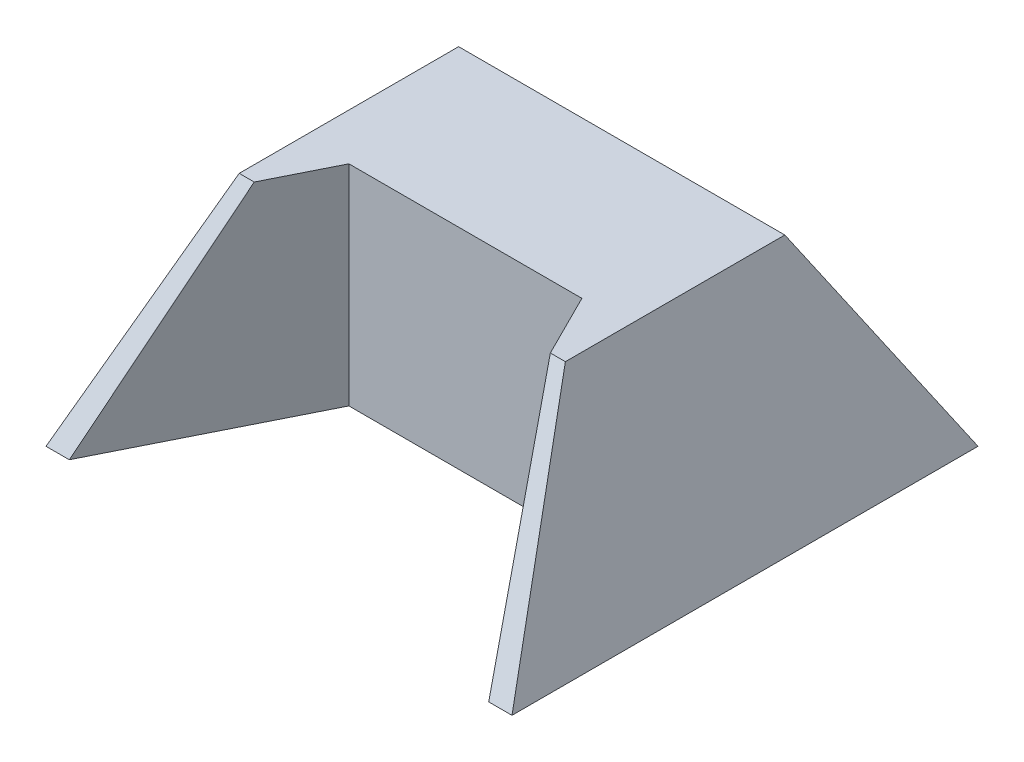
ISO-10303-21;
HEADER;
FILE_DESCRIPTION(('STEP AP214'),'2;1');
FILE_NAME('part.step','',(''),(''),'','','');
FILE_SCHEMA(('AUTOMOTIVE_DESIGN { 1 0 10303 214 1 1 1 1 }'));
ENDSEC;
DATA;
#1=APPLICATION_CONTEXT('core data for automotive mechanical design processes');
#2=APPLICATION_PROTOCOL_DEFINITION('international standard','automotive_design',2000,#1);
#3=PRODUCT_CONTEXT('',#1,'mechanical');
#4=PRODUCT('Part','Part','',(#3));
#5=PRODUCT_RELATED_PRODUCT_CATEGORY('part','',(#4));
#6=PRODUCT_DEFINITION_FORMATION('','',#4);
#7=PRODUCT_DEFINITION_CONTEXT('part definition',#1,'design');
#8=PRODUCT_DEFINITION('design','',#6,#7);
#9=PRODUCT_DEFINITION_SHAPE('','',#8);
#10=(LENGTH_UNIT() NAMED_UNIT(*) SI_UNIT(.MILLI.,.METRE.));
#11=(NAMED_UNIT(*) PLANE_ANGLE_UNIT() SI_UNIT($,.RADIAN.));
#12=(NAMED_UNIT(*) SI_UNIT($,.STERADIAN.) SOLID_ANGLE_UNIT());
#13=UNCERTAINTY_MEASURE_WITH_UNIT(LENGTH_MEASURE(1.E-05),#10,'distance_accuracy_value','');
#14=(GEOMETRIC_REPRESENTATION_CONTEXT(3) GLOBAL_UNCERTAINTY_ASSIGNED_CONTEXT((#13)) GLOBAL_UNIT_ASSIGNED_CONTEXT((#10,
#11,#12)) REPRESENTATION_CONTEXT('',''));
#15=CARTESIAN_POINT('',(0.,0.,0.));
#16=DIRECTION('',(0.,0.,1.));
#17=DIRECTION('',(1.,0.,0.));
#18=AXIS2_PLACEMENT_3D('',#15,#16,#17);
#19=CARTESIAN_POINT('',(100.,0.,0.));
#20=DIRECTION('',(0.,-0.50680946650861,-0.862058098191333));
#21=DIRECTION('',(0.,0.862058098191333,-0.50680946650861));
#22=AXIS2_PLACEMENT_3D('',#19,#20,#21);
#23=PLANE('',#22);
#24=DIRECTION('',(1.,0.,0.));
#25=VECTOR('',#24,1.);
#26=CARTESIAN_POINT('',(0.,0.,0.));
#27=LINE('',#26,#25);
#28=CARTESIAN_POINT('',(0.,0.,0.));
#29=VERTEX_POINT('',#28);
#30=CARTESIAN_POINT('',(5.,0.,0.));
#31=VERTEX_POINT('',#30);
#32=EDGE_CURVE('E152',#29,#31,#27,.T.);
#33=ORIENTED_EDGE('',*,*,#32,.T.);
#34=DIRECTION('',(0.245640655200604,0.83564546463383,-0.491281310401208));
#35=VECTOR('',#34,1.);
#36=CARTESIAN_POINT('',(10.7322364913013,19.5005074475664,-11.4644729826026));
#37=LINE('',#36,#35);
#38=CARTESIAN_POINT('',(18.2278938280014,45.,-26.4557876560027));
#39=VERTEX_POINT('',#38);
#40=EDGE_CURVE('E11',#31,#39,#37,.T.);
#41=ORIENTED_EDGE('',*,*,#40,.T.);
#42=DIRECTION('',(-1.,0.,0.));
#43=VECTOR('',#42,1.);
#44=CARTESIAN_POINT('',(100.,45.,-26.4557876560027));
#45=LINE('',#44,#43);
#46=CARTESIAN_POINT('',(15.,45.,-26.4557876560027));
#47=VERTEX_POINT('',#46);
#48=EDGE_CURVE('E124',#39,#47,#45,.T.);
#49=ORIENTED_EDGE('',*,*,#48,.T.);
#50=DIRECTION('',(-0.276176659095958,-0.828529977287874,0.487098069905794));
#51=VECTOR('',#50,1.);
#52=CARTESIAN_POINT('',(24.8935438142779,74.6806314428337,-43.9052206103958));
#53=LINE('',#52,#51);
#54=EDGE_CURVE('E138',#47,#29,#53,.T.);
#55=ORIENTED_EDGE('',*,*,#54,.T.);
#56=EDGE_LOOP('',(#33,#41,#49,#55));
#57=FACE_BOUND('',#56,.T.);
#58=ADVANCED_FACE('F37',(#57),#23,.F.);
#59=CARTESIAN_POINT('',(15.,45.,-100.));
#60=DIRECTION('',(-0.948683298050514,0.316227766016838,0.));
#61=DIRECTION('',(-0.316227766016838,-0.948683298050514,0.));
#62=AXIS2_PLACEMENT_3D('',#59,#60,#61);
#63=PLANE('',#62);
#64=ORIENTED_EDGE('',*,*,#54,.F.);
#65=DIRECTION('',(0.,0.,1.));
#66=VECTOR('',#65,1.);
#67=CARTESIAN_POINT('',(15.,45.,-100.));
#68=LINE('',#67,#66);
#69=CARTESIAN_POINT('',(15.,45.,-73.5442123439973));
#70=VERTEX_POINT('',#69);
#71=EDGE_CURVE('E155',#70,#47,#68,.T.);
#72=ORIENTED_EDGE('',*,*,#71,.F.);
#73=DIRECTION('',(-0.276176659095958,-0.828529977287874,-0.487098069905794));
#74=VECTOR('',#73,1.);
#75=CARTESIAN_POINT('',(11.4410320544107,34.3230961632322,-79.8212323601993));
#76=LINE('',#75,#74);
#77=CARTESIAN_POINT('',(0.,0.,-100.));
#78=VERTEX_POINT('',#77);
#79=EDGE_CURVE('E144',#70,#78,#76,.T.);
#80=ORIENTED_EDGE('',*,*,#79,.T.);
#81=DIRECTION('',(0.,0.,1.));
#82=VECTOR('',#81,1.);
#83=CARTESIAN_POINT('',(0.,0.,-100.));
#84=LINE('',#83,#82);
#85=EDGE_CURVE('E151',#78,#29,#84,.T.);
#86=ORIENTED_EDGE('',*,*,#85,.T.);
#87=EDGE_LOOP('',(#64,#72,#80,#86));
#88=FACE_BOUND('',#87,.T.);
#89=ADVANCED_FACE('F39',(#88),#63,.T.);
#90=CARTESIAN_POINT('',(85.,45.,-100.));
#91=DIRECTION('',(0.,1.,0.));
#92=DIRECTION('',(-1.,0.,0.));
#93=AXIS2_PLACEMENT_3D('',#90,#91,#92);
#94=PLANE('',#93);
#95=DIRECTION('',(0.447213595499958,0.,-0.894427190999916));
#96=VECTOR('',#95,1.);
#97=CARTESIAN_POINT('',(25.,45.,-40.));
#98=LINE('',#97,#96);
#99=CARTESIAN_POINT('',(25.,45.,-40.));
#100=VERTEX_POINT('',#99);
#101=EDGE_CURVE('E105',#39,#100,#98,.T.);
#102=ORIENTED_EDGE('',*,*,#101,.T.);
#103=DIRECTION('',(1.,0.,0.));
#104=VECTOR('',#103,1.);
#105=CARTESIAN_POINT('',(75.,45.,-40.));
#106=LINE('',#105,#104);
#107=CARTESIAN_POINT('',(75.,45.,-40.));
#108=VERTEX_POINT('',#107);
#109=EDGE_CURVE('E115',#100,#108,#106,.T.);
#110=ORIENTED_EDGE('',*,*,#109,.T.);
#111=DIRECTION('',(0.447213595499958,0.,0.894427190999916));
#112=VECTOR('',#111,1.);
#113=CARTESIAN_POINT('',(95.,45.,0.));
#114=LINE('',#113,#112);
#115=CARTESIAN_POINT('',(81.7721061719986,45.,-26.4557876560027));
#116=VERTEX_POINT('',#115);
#117=EDGE_CURVE('E112',#108,#116,#114,.T.);
#118=ORIENTED_EDGE('',*,*,#117,.T.);
#119=CARTESIAN_POINT('',(85.,45.,-26.4557876560027));
#120=VERTEX_POINT('',#119);
#121=EDGE_CURVE('E133',#120,#116,#45,.T.);
#122=ORIENTED_EDGE('',*,*,#121,.F.);
#123=DIRECTION('',(0.,0.,1.));
#124=VECTOR('',#123,1.);
#125=CARTESIAN_POINT('',(85.,45.,-100.));
#126=LINE('',#125,#124);
#127=CARTESIAN_POINT('',(85.,45.,-73.5442123439973));
#128=VERTEX_POINT('',#127);
#129=EDGE_CURVE('E157',#128,#120,#126,.T.);
#130=ORIENTED_EDGE('',*,*,#129,.F.);
#131=DIRECTION('',(-1.,0.,0.));
#132=VECTOR('',#131,1.);
#133=CARTESIAN_POINT('',(100.,45.,-73.5442123439973));
#134=LINE('',#133,#132);
#135=EDGE_CURVE('E140',#128,#70,#134,.T.);
#136=ORIENTED_EDGE('',*,*,#135,.T.);
#137=ORIENTED_EDGE('',*,*,#71,.T.);
#138=ORIENTED_EDGE('',*,*,#48,.F.);
#139=EDGE_LOOP('',(#102,#110,#118,#122,#130,#136,#137,#138));
#140=FACE_BOUND('',#139,.T.);
#141=ADVANCED_FACE('F122',(#140),#94,.T.);
#142=CARTESIAN_POINT('',(100.,0.,-100.));
#143=DIRECTION('',(0.948683298050514,0.316227766016838,0.));
#144=DIRECTION('',(-0.316227766016838,0.948683298050514,0.));
#145=AXIS2_PLACEMENT_3D('',#142,#143,#144);
#146=PLANE('',#145);
#147=DIRECTION('',(-0.276176659095958,0.828529977287874,-0.487098069905794));
#148=VECTOR('',#147,1.);
#149=CARTESIAN_POINT('',(86.5474882401328,40.3575352796015,-23.726452970595));
#150=LINE('',#149,#148);
#151=CARTESIAN_POINT('',(100.,0.,0.));
#152=VERTEX_POINT('',#151);
#153=EDGE_CURVE('E136',#152,#120,#150,.T.);
#154=ORIENTED_EDGE('',*,*,#153,.F.);
#155=DIRECTION('',(0.,0.,1.));
#156=VECTOR('',#155,1.);
#157=CARTESIAN_POINT('',(100.,0.,-100.));
#158=LINE('',#157,#156);
#159=CARTESIAN_POINT('',(100.,0.,-100.));
#160=VERTEX_POINT('',#159);
#161=EDGE_CURVE('E160',#160,#152,#158,.T.);
#162=ORIENTED_EDGE('',*,*,#161,.F.);
#163=DIRECTION('',(-0.276176659095958,0.828529977287874,0.487098069905794));
#164=VECTOR('',#163,1.);
#165=CARTESIAN_POINT('',(100.,0.,-100.));
#166=LINE('',#165,#164);
#167=EDGE_CURVE('E61',#160,#128,#166,.T.);
#168=ORIENTED_EDGE('',*,*,#167,.T.);
#169=ORIENTED_EDGE('',*,*,#129,.T.);
#170=EDGE_LOOP('',(#154,#162,#168,#169));
#171=FACE_BOUND('',#170,.T.);
#172=ADVANCED_FACE('F173',(#171),#146,.T.);
#173=CARTESIAN_POINT('',(0.,0.,-100.));
#174=DIRECTION('',(0.,-1.,0.));
#175=DIRECTION('',(0.,0.,-1.));
#176=AXIS2_PLACEMENT_3D('',#173,#174,#175);
#177=PLANE('',#176);
#178=DIRECTION('',(0.447213595499958,0.,-0.894427190999916));
#179=VECTOR('',#178,1.);
#180=CARTESIAN_POINT('',(25.,0.,-40.));
#181=LINE('',#180,#179);
#182=CARTESIAN_POINT('',(25.,0.,-40.));
#183=VERTEX_POINT('',#182);
#184=EDGE_CURVE('E107',#31,#183,#181,.T.);
#185=ORIENTED_EDGE('',*,*,#184,.F.);
#186=ORIENTED_EDGE('',*,*,#32,.F.);
#187=ORIENTED_EDGE('',*,*,#85,.F.);
#188=DIRECTION('',(1.,0.,0.));
#189=VECTOR('',#188,1.);
#190=CARTESIAN_POINT('',(0.,0.,-100.));
#191=LINE('',#190,#189);
#192=EDGE_CURVE('E148',#78,#160,#191,.T.);
#193=ORIENTED_EDGE('',*,*,#192,.T.);
#194=ORIENTED_EDGE('',*,*,#161,.T.);
#195=CARTESIAN_POINT('',(95.,0.,0.));
#196=VERTEX_POINT('',#195);
#197=EDGE_CURVE('E147',#196,#152,#27,.T.);
#198=ORIENTED_EDGE('',*,*,#197,.F.);
#199=DIRECTION('',(0.447213595499958,0.,0.894427190999916));
#200=VECTOR('',#199,1.);
#201=CARTESIAN_POINT('',(95.,0.,0.));
#202=LINE('',#201,#200);
#203=CARTESIAN_POINT('',(75.,0.,-40.));
#204=VERTEX_POINT('',#203);
#205=EDGE_CURVE('E52',#204,#196,#202,.T.);
#206=ORIENTED_EDGE('',*,*,#205,.F.);
#207=DIRECTION('',(1.,0.,0.));
#208=VECTOR('',#207,1.);
#209=CARTESIAN_POINT('',(75.,0.,-40.));
#210=LINE('',#209,#208);
#211=EDGE_CURVE('E126',#183,#204,#210,.T.);
#212=ORIENTED_EDGE('',*,*,#211,.F.);
#213=EDGE_LOOP('',(#185,#186,#187,#193,#194,#198,#206,#212));
#214=FACE_BOUND('',#213,.T.);
#215=ADVANCED_FACE('F170',(#214),#177,.T.);
#216=CARTESIAN_POINT('',(100.,0.,-100.));
#217=DIRECTION('',(0.,0.50680946650861,-0.862058098191333));
#218=DIRECTION('',(0.,0.862058098191333,0.50680946650861));
#219=AXIS2_PLACEMENT_3D('',#216,#217,#218);
#220=PLANE('',#219);
#221=ORIENTED_EDGE('',*,*,#135,.F.);
#222=ORIENTED_EDGE('',*,*,#167,.F.);
#223=ORIENTED_EDGE('',*,*,#192,.F.);
#224=ORIENTED_EDGE('',*,*,#79,.F.);
#225=EDGE_LOOP('',(#221,#222,#223,#224));
#226=FACE_BOUND('',#225,.T.);
#227=ADVANCED_FACE('F181',(#226),#220,.T.);
#228=ORIENTED_EDGE('',*,*,#121,.T.);
#229=DIRECTION('',(0.245640655200604,-0.83564546463383,0.491281310401208));
#230=VECTOR('',#229,1.);
#231=CARTESIAN_POINT('',(95.3016966574369,-1.02634249724034,0.60339331487382));
#232=LINE('',#231,#230);
#233=EDGE_CURVE('E45',#116,#196,#232,.T.);
#234=ORIENTED_EDGE('',*,*,#233,.T.);
#235=ORIENTED_EDGE('',*,*,#197,.T.);
#236=ORIENTED_EDGE('',*,*,#153,.T.);
#237=EDGE_LOOP('',(#228,#234,#235,#236));
#238=FACE_BOUND('',#237,.T.);
#239=ADVANCED_FACE('F166',(#238),#23,.F.);
#240=CARTESIAN_POINT('',(25.,45.,-40.));
#241=DIRECTION('',(-0.894427190999916,0.,-0.447213595499958));
#242=DIRECTION('',(-0.447213595499958,0.,0.894427190999916));
#243=AXIS2_PLACEMENT_3D('',#240,#241,#242);
#244=PLANE('',#243);
#245=ORIENTED_EDGE('',*,*,#184,.T.);
#246=DIRECTION('',(0.,-1.,0.));
#247=VECTOR('',#246,1.);
#248=CARTESIAN_POINT('',(25.,45.,-40.));
#249=LINE('',#248,#247);
#250=EDGE_CURVE('E101',#100,#183,#249,.T.);
#251=ORIENTED_EDGE('',*,*,#250,.F.);
#252=ORIENTED_EDGE('',*,*,#101,.F.);
#253=ORIENTED_EDGE('',*,*,#40,.F.);
#254=EDGE_LOOP('',(#245,#251,#252,#253));
#255=FACE_BOUND('',#254,.T.);
#256=ADVANCED_FACE('F103',(#255),#244,.F.);
#257=CARTESIAN_POINT('',(95.,45.,0.));
#258=DIRECTION('',(0.894427190999916,0.,-0.447213595499958));
#259=DIRECTION('',(-0.447213595499958,0.,-0.894427190999916));
#260=AXIS2_PLACEMENT_3D('',#257,#258,#259);
#261=PLANE('',#260);
#262=ORIENTED_EDGE('',*,*,#117,.F.);
#263=DIRECTION('',(0.,-1.,0.));
#264=VECTOR('',#263,1.);
#265=CARTESIAN_POINT('',(75.,45.,-40.));
#266=LINE('',#265,#264);
#267=EDGE_CURVE('E111',#108,#204,#266,.T.);
#268=ORIENTED_EDGE('',*,*,#267,.T.);
#269=ORIENTED_EDGE('',*,*,#205,.T.);
#270=ORIENTED_EDGE('',*,*,#233,.F.);
#271=EDGE_LOOP('',(#262,#268,#269,#270));
#272=FACE_BOUND('',#271,.T.);
#273=ADVANCED_FACE('F175',(#272),#261,.F.);
#274=CARTESIAN_POINT('',(75.,45.,-40.));
#275=DIRECTION('',(0.,0.,-1.));
#276=DIRECTION('',(-1.,0.,0.));
#277=AXIS2_PLACEMENT_3D('',#274,#275,#276);
#278=PLANE('',#277);
#279=ORIENTED_EDGE('',*,*,#211,.T.);
#280=ORIENTED_EDGE('',*,*,#267,.F.);
#281=ORIENTED_EDGE('',*,*,#109,.F.);
#282=ORIENTED_EDGE('',*,*,#250,.T.);
#283=EDGE_LOOP('',(#279,#280,#281,#282));
#284=FACE_BOUND('',#283,.T.);
#285=ADVANCED_FACE('F116',(#284),#278,.F.);
#286=CLOSED_SHELL('',(#58,#89,#141,#172,#215,#227,#239,#256,#273,#285));
#287=MANIFOLD_SOLID_BREP('B2',#286);
#288=ADVANCED_BREP_SHAPE_REPRESENTATION('',(#18,#287),#14);
#289=SHAPE_DEFINITION_REPRESENTATION(#9,#288);
ENDSEC;
END-ISO-10303-21;
